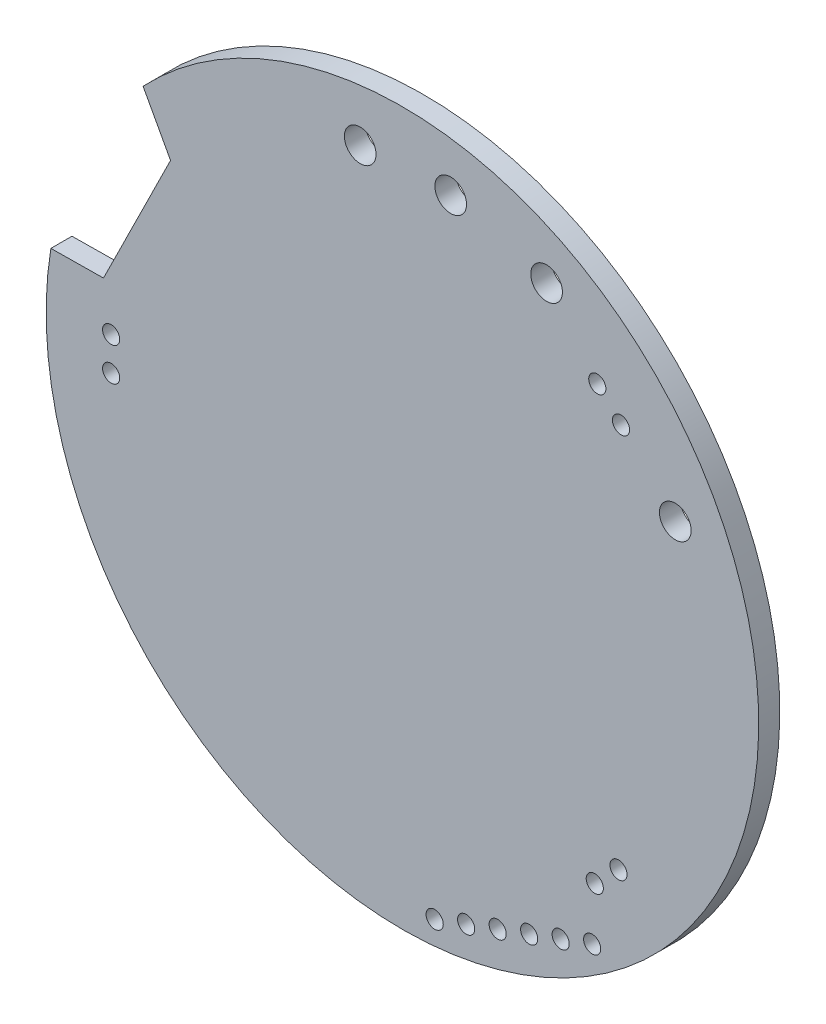
ISO-10303-21;
HEADER;
FILE_DESCRIPTION(('STEP AP214'),'2;1');
FILE_NAME('part.step','',(''),(''),'','','');
FILE_SCHEMA(('AUTOMOTIVE_DESIGN { 1 0 10303 214 1 1 1 1 }'));
ENDSEC;
DATA;
#1=APPLICATION_CONTEXT('core data for automotive mechanical design processes');
#2=APPLICATION_PROTOCOL_DEFINITION('international standard','automotive_design',2000,#1);
#3=PRODUCT_CONTEXT('',#1,'mechanical');
#4=PRODUCT('Part','Part','',(#3));
#5=PRODUCT_RELATED_PRODUCT_CATEGORY('part','',(#4));
#6=PRODUCT_DEFINITION_FORMATION('','',#4);
#7=PRODUCT_DEFINITION_CONTEXT('part definition',#1,'design');
#8=PRODUCT_DEFINITION('design','',#6,#7);
#9=PRODUCT_DEFINITION_SHAPE('','',#8);
#10=(LENGTH_UNIT() NAMED_UNIT(*) SI_UNIT(.MILLI.,.METRE.));
#11=(NAMED_UNIT(*) PLANE_ANGLE_UNIT() SI_UNIT($,.RADIAN.));
#12=(NAMED_UNIT(*) SI_UNIT($,.STERADIAN.) SOLID_ANGLE_UNIT());
#13=UNCERTAINTY_MEASURE_WITH_UNIT(LENGTH_MEASURE(1.E-05),#10,'distance_accuracy_value','');
#14=(GEOMETRIC_REPRESENTATION_CONTEXT(3) GLOBAL_UNCERTAINTY_ASSIGNED_CONTEXT((#13)) GLOBAL_UNIT_ASSIGNED_CONTEXT((#10,
#11,#12)) REPRESENTATION_CONTEXT('',''));
#15=CARTESIAN_POINT('',(0.,0.,0.));
#16=DIRECTION('',(0.,0.,1.));
#17=DIRECTION('',(1.,0.,0.));
#18=AXIS2_PLACEMENT_3D('',#15,#16,#17);
#19=CARTESIAN_POINT('',(77.356002807617,84.533996582031,0.));
#20=DIRECTION('',(0.,0.,-1.));
#21=DIRECTION('',(0.,-1.,0.));
#22=AXIS2_PLACEMENT_3D('',#19,#20,#21);
#23=PLANE('',#22);
#24=CARTESIAN_POINT('',(98.9582476,89.54208914,0.));
#25=DIRECTION('',(0.,0.,1.));
#26=DIRECTION('',(1.,0.,0.));
#27=AXIS2_PLACEMENT_3D('',#24,#25,#26);
#28=CIRCLE('',#27,0.32500062);
#29=CARTESIAN_POINT('',(99.28324822,89.54208914,0.));
#30=VERTEX_POINT('',#29);
#31=EDGE_CURVE('E27',#30,#30,#28,.T.);
#32=ORIENTED_EDGE('',*,*,#31,.F.);
#33=EDGE_LOOP('',(#32));
#34=FACE_BOUND('',#33,.T.);
#35=CARTESIAN_POINT('',(101.0158,87.4014,0.));
#36=DIRECTION('',(0.,0.,1.));
#37=DIRECTION('',(1.,0.,0.));
#38=AXIS2_PLACEMENT_3D('',#35,#36,#37);
#39=CIRCLE('',#38,0.5999988);
#40=CARTESIAN_POINT('',(101.6157988,87.4014,0.));
#41=VERTEX_POINT('',#40);
#42=EDGE_CURVE('E364',#41,#41,#39,.T.);
#43=ORIENTED_EDGE('',*,*,#42,.F.);
#44=EDGE_LOOP('',(#43));
#45=FACE_BOUND('',#44,.T.);
#46=CARTESIAN_POINT('',(96.139,92.7862,0.));
#47=DIRECTION('',(0.,0.,1.));
#48=DIRECTION('',(1.,0.,0.));
#49=AXIS2_PLACEMENT_3D('',#46,#47,#48);
#50=CIRCLE('',#49,0.5999988);
#51=CARTESIAN_POINT('',(96.7389988,92.7862,0.));
#52=VERTEX_POINT('',#51);
#53=EDGE_CURVE('E315',#52,#52,#50,.T.);
#54=ORIENTED_EDGE('',*,*,#53,.F.);
#55=EDGE_LOOP('',(#54));
#56=FACE_BOUND('',#55,.T.);
#57=CARTESIAN_POINT('',(98.06022298,90.44011376,0.));
#58=DIRECTION('',(0.,0.,1.));
#59=DIRECTION('',(1.,0.,0.));
#60=AXIS2_PLACEMENT_3D('',#57,#58,#59);
#61=CIRCLE('',#60,0.32500062);
#62=CARTESIAN_POINT('',(98.3852236,90.44011376,0.));
#63=VERTEX_POINT('',#62);
#64=EDGE_CURVE('E261',#63,#63,#61,.T.);
#65=ORIENTED_EDGE('',*,*,#64,.F.);
#66=EDGE_LOOP('',(#65));
#67=FACE_BOUND('',#66,.T.);
#68=CARTESIAN_POINT('',(98.8633786,74.89722384,0.));
#69=DIRECTION('',(0.,0.,1.));
#70=DIRECTION('',(1.,0.,0.));
#71=AXIS2_PLACEMENT_3D('',#68,#69,#70);
#72=CIRCLE('',#71,0.32500062);
#73=CARTESIAN_POINT('',(99.18837922,74.89722384,0.));
#74=VERTEX_POINT('',#73);
#75=EDGE_CURVE('E209',#74,#74,#72,.T.);
#76=ORIENTED_EDGE('',*,*,#75,.F.);
#77=EDGE_LOOP('',(#76));
#78=FACE_BOUND('',#77,.T.);
#79=CARTESIAN_POINT('',(97.96535398,73.99919922,0.));
#80=DIRECTION('',(0.,0.,1.));
#81=DIRECTION('',(1.,0.,0.));
#82=AXIS2_PLACEMENT_3D('',#79,#80,#81);
#83=CIRCLE('',#82,0.32500062);
#84=CARTESIAN_POINT('',(98.2903546,73.99919922,0.));
#85=VERTEX_POINT('',#84);
#86=EDGE_CURVE('E239',#85,#85,#83,.T.);
#87=ORIENTED_EDGE('',*,*,#86,.F.);
#88=EDGE_LOOP('',(#87));
#89=FACE_BOUND('',#88,.T.);
#90=CARTESIAN_POINT('',(97.8658063,71.96076794,0.));
#91=DIRECTION('',(0.,0.,1.));
#92=DIRECTION('',(1.,0.,0.));
#93=AXIS2_PLACEMENT_3D('',#90,#91,#92);
#94=CIRCLE('',#93,0.32500062);
#95=CARTESIAN_POINT('',(98.19080692,71.96076794,0.));
#96=VERTEX_POINT('',#95);
#97=EDGE_CURVE('E188',#96,#96,#94,.T.);
#98=ORIENTED_EDGE('',*,*,#97,.F.);
#99=EDGE_LOOP('',(#98));
#100=FACE_BOUND('',#99,.T.);
#101=CARTESIAN_POINT('',(96.6724,71.5264,0.));
#102=DIRECTION('',(0.,0.,1.));
#103=DIRECTION('',(1.,0.,0.));
#104=AXIS2_PLACEMENT_3D('',#101,#102,#103);
#105=CIRCLE('',#104,0.32500062);
#106=CARTESIAN_POINT('',(96.99740062,71.5264,0.));
#107=VERTEX_POINT('',#106);
#108=EDGE_CURVE('E195',#107,#107,#105,.T.);
#109=ORIENTED_EDGE('',*,*,#108,.F.);
#110=EDGE_LOOP('',(#109));
#111=FACE_BOUND('',#110,.T.);
#112=CARTESIAN_POINT('',(92.5068,93.853,0.));
#113=DIRECTION('',(0.,0.,1.));
#114=DIRECTION('',(1.,0.,0.));
#115=AXIS2_PLACEMENT_3D('',#112,#113,#114);
#116=CIRCLE('',#115,0.5999988);
#117=CARTESIAN_POINT('',(93.1067988,93.853,0.));
#118=VERTEX_POINT('',#117);
#119=EDGE_CURVE('E250',#118,#118,#116,.T.);
#120=ORIENTED_EDGE('',*,*,#119,.F.);
#121=EDGE_LOOP('',(#120));
#122=FACE_BOUND('',#121,.T.);
#123=CARTESIAN_POINT('',(89.0778,93.7768,0.));
#124=DIRECTION('',(0.,0.,1.));
#125=DIRECTION('',(1.,0.,0.));
#126=AXIS2_PLACEMENT_3D('',#123,#124,#125);
#127=CIRCLE('',#126,0.5999988);
#128=CARTESIAN_POINT('',(89.6777988,93.7768,0.));
#129=VERTEX_POINT('',#128);
#130=EDGE_CURVE('E217',#129,#129,#127,.T.);
#131=ORIENTED_EDGE('',*,*,#130,.F.);
#132=EDGE_LOOP('',(#131));
#133=FACE_BOUND('',#132,.T.);
#134=CARTESIAN_POINT('',(79.6403538,82.8491993,0.));
#135=DIRECTION('',(0.,0.,1.));
#136=DIRECTION('',(1.,0.,0.));
#137=AXIS2_PLACEMENT_3D('',#134,#135,#136);
#138=CIRCLE('',#137,0.32500062);
#139=CARTESIAN_POINT('',(79.96535442,82.8491993,0.));
#140=VERTEX_POINT('',#139);
#141=EDGE_CURVE('E215',#140,#140,#138,.T.);
#142=ORIENTED_EDGE('',*,*,#141,.F.);
#143=EDGE_LOOP('',(#142));
#144=FACE_BOUND('',#143,.T.);
#145=CARTESIAN_POINT('',(79.6403538,81.5791993,0.));
#146=DIRECTION('',(0.,0.,1.));
#147=DIRECTION('',(1.,0.,0.));
#148=AXIS2_PLACEMENT_3D('',#145,#146,#147);
#149=CIRCLE('',#148,0.32500062);
#150=CARTESIAN_POINT('',(79.96535442,81.5791993,0.));
#151=VERTEX_POINT('',#150);
#152=EDGE_CURVE('E249',#151,#151,#149,.T.);
#153=ORIENTED_EDGE('',*,*,#152,.F.);
#154=EDGE_LOOP('',(#153));
#155=FACE_BOUND('',#154,.T.);
#156=CARTESIAN_POINT('',(95.47898862,71.09202952,0.));
#157=DIRECTION('',(0.,0.,1.));
#158=DIRECTION('',(1.,0.,0.));
#159=AXIS2_PLACEMENT_3D('',#156,#157,#158);
#160=CIRCLE('',#159,0.32500062);
#161=CARTESIAN_POINT('',(95.80398924,71.09202952,0.));
#162=VERTEX_POINT('',#161);
#163=EDGE_CURVE('E275',#162,#162,#160,.T.);
#164=ORIENTED_EDGE('',*,*,#163,.F.);
#165=EDGE_LOOP('',(#164));
#166=FACE_BOUND('',#165,.T.);
#167=CARTESIAN_POINT('',(94.28557978,70.6576692,0.));
#168=DIRECTION('',(0.,0.,1.));
#169=DIRECTION('',(1.,0.,0.));
#170=AXIS2_PLACEMENT_3D('',#167,#168,#169);
#171=CIRCLE('',#170,0.32500062);
#172=CARTESIAN_POINT('',(94.6105804,70.6576692,0.));
#173=VERTEX_POINT('',#172);
#174=EDGE_CURVE('E183',#173,#173,#171,.T.);
#175=ORIENTED_EDGE('',*,*,#174,.F.);
#176=EDGE_LOOP('',(#175));
#177=FACE_BOUND('',#176,.T.);
#178=CARTESIAN_POINT('',(93.0921557,70.22329872,0.));
#179=DIRECTION('',(0.,0.,1.));
#180=DIRECTION('',(1.,0.,0.));
#181=AXIS2_PLACEMENT_3D('',#178,#179,#180);
#182=CIRCLE('',#181,0.32500062);
#183=CARTESIAN_POINT('',(93.41715632,70.22329872,0.));
#184=VERTEX_POINT('',#183);
#185=EDGE_CURVE('E236',#184,#184,#182,.T.);
#186=ORIENTED_EDGE('',*,*,#185,.F.);
#187=EDGE_LOOP('',(#186));
#188=FACE_BOUND('',#187,.T.);
#189=CARTESIAN_POINT('',(91.89875448,69.78893586,0.));
#190=DIRECTION('',(0.,0.,1.));
#191=DIRECTION('',(1.,0.,0.));
#192=AXIS2_PLACEMENT_3D('',#189,#190,#191);
#193=CIRCLE('',#192,0.32500062);
#194=CARTESIAN_POINT('',(92.2237551,69.78893586,0.));
#195=VERTEX_POINT('',#194);
#196=EDGE_CURVE('E157',#195,#195,#193,.T.);
#197=ORIENTED_EDGE('',*,*,#196,.F.);
#198=EDGE_LOOP('',(#197));
#199=FACE_BOUND('',#198,.T.);
#200=CARTESIAN_POINT('',(90.677297083043,82.34505011491,0.));
#201=DIRECTION('',(0.,0.,1.));
#202=DIRECTION('',(-0.986766957566009,0.162144908819001,0.));
#203=AXIS2_PLACEMENT_3D('',#200,#201,#202);
#204=CIRCLE('',#203,13.499939548324);
#205=CARTESIAN_POINT('',(77.356002807617,84.533996582031,0.));
#206=VERTEX_POINT('',#205);
#207=CARTESIAN_POINT('',(80.849998474121,91.600997924805,0.));
#208=VERTEX_POINT('',#207);
#209=EDGE_CURVE('E333',#206,#208,#204,.T.);
#210=ORIENTED_EDGE('',*,*,#209,.T.);
#211=DIRECTION('',(0.477436318378299,-0.878666354137551,0.));
#212=VECTOR('',#211,1.);
#213=CARTESIAN_POINT('',(80.849998474121,91.600997924805,0.));
#214=LINE('',#213,#212);
#215=CARTESIAN_POINT('',(81.889999389648,89.686996459961,0.));
#216=VERTEX_POINT('',#215);
#217=EDGE_CURVE('E176',#208,#216,#214,.T.);
#218=ORIENTED_EDGE('',*,*,#217,.T.);
#219=DIRECTION('',(-0.443716673249112,-0.896167123856226,0.));
#220=VECTOR('',#219,1.);
#221=CARTESIAN_POINT('',(81.889999389648,89.686996459961,0.));
#222=LINE('',#221,#220);
#223=CARTESIAN_POINT('',(79.349998474121,84.556999206543,0.));
#224=VERTEX_POINT('',#223);
#225=EDGE_CURVE('E20',#216,#224,#222,.T.);
#226=ORIENTED_EDGE('',*,*,#225,.T.);
#227=DIRECTION('',(-0.999933467625904,-0.0115351775727889,0.));
#228=VECTOR('',#227,1.);
#229=CARTESIAN_POINT('',(79.349998474121,84.556999206543,0.));
#230=LINE('',#229,#228);
#231=EDGE_CURVE('E172',#224,#206,#230,.T.);
#232=ORIENTED_EDGE('',*,*,#231,.T.);
#233=EDGE_LOOP('',(#210,#218,#226,#232));
#234=FACE_BOUND('',#233,.T.);
#235=ADVANCED_FACE('F16',(#34,#45,#56,#67,#78,#89,#100,#111,#122,#133,#144,#155,#166,#177,#188,
#199,#234),#23,.F.);
#236=CARTESIAN_POINT('',(77.356002807617,84.533996582031,-0.7984236));
#237=DIRECTION('',(0.,0.,-1.));
#238=DIRECTION('',(0.,-1.,0.));
#239=AXIS2_PLACEMENT_3D('',#236,#237,#238);
#240=PLANE('',#239);
#241=CARTESIAN_POINT('',(98.9582476,89.54208914,-0.7984236));
#242=DIRECTION('',(0.,0.,1.));
#243=DIRECTION('',(1.,0.,0.));
#244=AXIS2_PLACEMENT_3D('',#241,#242,#243);
#245=CIRCLE('',#244,0.32500062);
#246=CARTESIAN_POINT('',(99.28324822,89.54208914,-0.7984236));
#247=VERTEX_POINT('',#246);
#248=EDGE_CURVE('E11',#247,#247,#245,.T.);
#249=ORIENTED_EDGE('',*,*,#248,.T.);
#250=EDGE_LOOP('',(#249));
#251=FACE_BOUND('',#250,.T.);
#252=CARTESIAN_POINT('',(101.0158,87.4014,-0.7984236));
#253=DIRECTION('',(0.,0.,1.));
#254=DIRECTION('',(1.,0.,0.));
#255=AXIS2_PLACEMENT_3D('',#252,#253,#254);
#256=CIRCLE('',#255,0.5999988);
#257=CARTESIAN_POINT('',(101.6157988,87.4014,-0.7984236));
#258=VERTEX_POINT('',#257);
#259=EDGE_CURVE('E282',#258,#258,#256,.T.);
#260=ORIENTED_EDGE('',*,*,#259,.T.);
#261=EDGE_LOOP('',(#260));
#262=FACE_BOUND('',#261,.T.);
#263=CARTESIAN_POINT('',(96.139,92.7862,-0.7984236));
#264=DIRECTION('',(0.,0.,1.));
#265=DIRECTION('',(1.,0.,0.));
#266=AXIS2_PLACEMENT_3D('',#263,#264,#265);
#267=CIRCLE('',#266,0.5999988);
#268=CARTESIAN_POINT('',(96.7389988,92.7862,-0.7984236));
#269=VERTEX_POINT('',#268);
#270=EDGE_CURVE('E326',#269,#269,#267,.T.);
#271=ORIENTED_EDGE('',*,*,#270,.T.);
#272=EDGE_LOOP('',(#271));
#273=FACE_BOUND('',#272,.T.);
#274=CARTESIAN_POINT('',(98.06022298,90.44011376,-0.7984236));
#275=DIRECTION('',(0.,0.,1.));
#276=DIRECTION('',(1.,0.,0.));
#277=AXIS2_PLACEMENT_3D('',#274,#275,#276);
#278=CIRCLE('',#277,0.32500062);
#279=CARTESIAN_POINT('',(98.3852236,90.44011376,-0.7984236));
#280=VERTEX_POINT('',#279);
#281=EDGE_CURVE('E276',#280,#280,#278,.T.);
#282=ORIENTED_EDGE('',*,*,#281,.T.);
#283=EDGE_LOOP('',(#282));
#284=FACE_BOUND('',#283,.T.);
#285=CARTESIAN_POINT('',(98.8633786,74.89722384,-0.7984236));
#286=DIRECTION('',(0.,0.,1.));
#287=DIRECTION('',(1.,0.,0.));
#288=AXIS2_PLACEMENT_3D('',#285,#286,#287);
#289=CIRCLE('',#288,0.32500062);
#290=CARTESIAN_POINT('',(99.18837922,74.89722384,-0.7984236));
#291=VERTEX_POINT('',#290);
#292=EDGE_CURVE('E227',#291,#291,#289,.T.);
#293=ORIENTED_EDGE('',*,*,#292,.T.);
#294=EDGE_LOOP('',(#293));
#295=FACE_BOUND('',#294,.T.);
#296=CARTESIAN_POINT('',(97.96535398,73.99919922,-0.7984236));
#297=DIRECTION('',(0.,0.,1.));
#298=DIRECTION('',(1.,0.,0.));
#299=AXIS2_PLACEMENT_3D('',#296,#297,#298);
#300=CIRCLE('',#299,0.32500062);
#301=CARTESIAN_POINT('',(98.2903546,73.99919922,-0.7984236));
#302=VERTEX_POINT('',#301);
#303=EDGE_CURVE('E210',#302,#302,#300,.T.);
#304=ORIENTED_EDGE('',*,*,#303,.T.);
#305=EDGE_LOOP('',(#304));
#306=FACE_BOUND('',#305,.T.);
#307=CARTESIAN_POINT('',(97.8658063,71.96076794,-0.7984236));
#308=DIRECTION('',(0.,0.,1.));
#309=DIRECTION('',(1.,0.,0.));
#310=AXIS2_PLACEMENT_3D('',#307,#308,#309);
#311=CIRCLE('',#310,0.32500062);
#312=CARTESIAN_POINT('',(98.19080692,71.96076794,-0.7984236));
#313=VERTEX_POINT('',#312);
#314=EDGE_CURVE('E343',#313,#313,#311,.T.);
#315=ORIENTED_EDGE('',*,*,#314,.T.);
#316=EDGE_LOOP('',(#315));
#317=FACE_BOUND('',#316,.T.);
#318=CARTESIAN_POINT('',(96.6724,71.5264,-0.7984236));
#319=DIRECTION('',(0.,0.,1.));
#320=DIRECTION('',(1.,0.,0.));
#321=AXIS2_PLACEMENT_3D('',#318,#319,#320);
#322=CIRCLE('',#321,0.32500062);
#323=CARTESIAN_POINT('',(96.99740062,71.5264,-0.7984236));
#324=VERTEX_POINT('',#323);
#325=EDGE_CURVE('E189',#324,#324,#322,.T.);
#326=ORIENTED_EDGE('',*,*,#325,.T.);
#327=EDGE_LOOP('',(#326));
#328=FACE_BOUND('',#327,.T.);
#329=CARTESIAN_POINT('',(92.5068,93.853,-0.7984236));
#330=DIRECTION('',(0.,0.,1.));
#331=DIRECTION('',(1.,0.,0.));
#332=AXIS2_PLACEMENT_3D('',#329,#330,#331);
#333=CIRCLE('',#332,0.5999988);
#334=CARTESIAN_POINT('',(93.1067988,93.853,-0.7984236));
#335=VERTEX_POINT('',#334);
#336=EDGE_CURVE('E253',#335,#335,#333,.T.);
#337=ORIENTED_EDGE('',*,*,#336,.T.);
#338=EDGE_LOOP('',(#337));
#339=FACE_BOUND('',#338,.T.);
#340=CARTESIAN_POINT('',(89.0778,93.7768,-0.7984236));
#341=DIRECTION('',(0.,0.,1.));
#342=DIRECTION('',(1.,0.,0.));
#343=AXIS2_PLACEMENT_3D('',#340,#341,#342);
#344=CIRCLE('',#343,0.5999988);
#345=CARTESIAN_POINT('',(89.6777988,93.7768,-0.7984236));
#346=VERTEX_POINT('',#345);
#347=EDGE_CURVE('E220',#346,#346,#344,.T.);
#348=ORIENTED_EDGE('',*,*,#347,.T.);
#349=EDGE_LOOP('',(#348));
#350=FACE_BOUND('',#349,.T.);
#351=CARTESIAN_POINT('',(79.6403538,82.8491993,-0.7984236));
#352=DIRECTION('',(0.,0.,1.));
#353=DIRECTION('',(1.,0.,0.));
#354=AXIS2_PLACEMENT_3D('',#351,#352,#353);
#355=CIRCLE('',#354,0.32500062);
#356=CARTESIAN_POINT('',(79.96535442,82.8491993,-0.7984236));
#357=VERTEX_POINT('',#356);
#358=EDGE_CURVE('E243',#357,#357,#355,.T.);
#359=ORIENTED_EDGE('',*,*,#358,.T.);
#360=EDGE_LOOP('',(#359));
#361=FACE_BOUND('',#360,.T.);
#362=CARTESIAN_POINT('',(79.6403538,81.5791993,-0.7984236));
#363=DIRECTION('',(0.,0.,1.));
#364=DIRECTION('',(1.,0.,0.));
#365=AXIS2_PLACEMENT_3D('',#362,#363,#364);
#366=CIRCLE('',#365,0.32500062);
#367=CARTESIAN_POINT('',(79.96535442,81.5791993,-0.7984236));
#368=VERTEX_POINT('',#367);
#369=EDGE_CURVE('E216',#368,#368,#366,.T.);
#370=ORIENTED_EDGE('',*,*,#369,.T.);
#371=EDGE_LOOP('',(#370));
#372=FACE_BOUND('',#371,.T.);
#373=CARTESIAN_POINT('',(95.47898862,71.09202952,-0.7984236));
#374=DIRECTION('',(0.,0.,1.));
#375=DIRECTION('',(1.,0.,0.));
#376=AXIS2_PLACEMENT_3D('',#373,#374,#375);
#377=CIRCLE('',#376,0.32500062);
#378=CARTESIAN_POINT('',(95.80398924,71.09202952,-0.7984236));
#379=VERTEX_POINT('',#378);
#380=EDGE_CURVE('E271',#379,#379,#377,.T.);
#381=ORIENTED_EDGE('',*,*,#380,.T.);
#382=EDGE_LOOP('',(#381));
#383=FACE_BOUND('',#382,.T.);
#384=CARTESIAN_POINT('',(94.28557978,70.6576692,-0.7984236));
#385=DIRECTION('',(0.,0.,1.));
#386=DIRECTION('',(1.,0.,0.));
#387=AXIS2_PLACEMENT_3D('',#384,#385,#386);
#388=CIRCLE('',#387,0.32500062);
#389=CARTESIAN_POINT('',(94.6105804,70.6576692,-0.7984236));
#390=VERTEX_POINT('',#389);
#391=EDGE_CURVE('E178',#390,#390,#388,.T.);
#392=ORIENTED_EDGE('',*,*,#391,.T.);
#393=EDGE_LOOP('',(#392));
#394=FACE_BOUND('',#393,.T.);
#395=CARTESIAN_POINT('',(93.0921557,70.22329872,-0.7984236));
#396=DIRECTION('',(0.,0.,1.));
#397=DIRECTION('',(1.,0.,0.));
#398=AXIS2_PLACEMENT_3D('',#395,#396,#397);
#399=CIRCLE('',#398,0.32500062);
#400=CARTESIAN_POINT('',(93.41715632,70.22329872,-0.7984236));
#401=VERTEX_POINT('',#400);
#402=EDGE_CURVE('E232',#401,#401,#399,.T.);
#403=ORIENTED_EDGE('',*,*,#402,.T.);
#404=EDGE_LOOP('',(#403));
#405=FACE_BOUND('',#404,.T.);
#406=CARTESIAN_POINT('',(91.89875448,69.78893586,-0.7984236));
#407=DIRECTION('',(0.,0.,1.));
#408=DIRECTION('',(1.,0.,0.));
#409=AXIS2_PLACEMENT_3D('',#406,#407,#408);
#410=CIRCLE('',#409,0.32500062);
#411=CARTESIAN_POINT('',(92.2237551,69.78893586,-0.7984236));
#412=VERTEX_POINT('',#411);
#413=EDGE_CURVE('E163',#412,#412,#410,.T.);
#414=ORIENTED_EDGE('',*,*,#413,.T.);
#415=EDGE_LOOP('',(#414));
#416=FACE_BOUND('',#415,.T.);
#417=DIRECTION('',(-0.999933467625904,-0.0115351775727889,0.));
#418=VECTOR('',#417,1.);
#419=CARTESIAN_POINT('',(79.349998474121,84.556999206543,-0.7984236));
#420=LINE('',#419,#418);
#421=CARTESIAN_POINT('',(79.349998474121,84.556999206543,-0.7984236));
#422=VERTEX_POINT('',#421);
#423=CARTESIAN_POINT('',(77.356002807617,84.533996582031,-0.7984236));
#424=VERTEX_POINT('',#423);
#425=EDGE_CURVE('E268',#422,#424,#420,.T.);
#426=ORIENTED_EDGE('',*,*,#425,.F.);
#427=DIRECTION('',(-0.443716673249112,-0.896167123856226,0.));
#428=VECTOR('',#427,1.);
#429=CARTESIAN_POINT('',(81.889999389648,89.686996459961,-0.7984236));
#430=LINE('',#429,#428);
#431=CARTESIAN_POINT('',(81.889999389648,89.686996459961,-0.7984236));
#432=VERTEX_POINT('',#431);
#433=EDGE_CURVE('E194',#432,#422,#430,.T.);
#434=ORIENTED_EDGE('',*,*,#433,.F.);
#435=DIRECTION('',(0.477436318378299,-0.878666354137551,0.));
#436=VECTOR('',#435,1.);
#437=CARTESIAN_POINT('',(80.849998474121,91.600997924805,-0.7984236));
#438=LINE('',#437,#436);
#439=CARTESIAN_POINT('',(80.849998474121,91.600997924805,-0.7984236));
#440=VERTEX_POINT('',#439);
#441=EDGE_CURVE('E204',#440,#432,#438,.T.);
#442=ORIENTED_EDGE('',*,*,#441,.F.);
#443=CARTESIAN_POINT('',(90.677297083043,82.34505011491,-0.7984236));
#444=DIRECTION('',(0.,0.,1.));
#445=DIRECTION('',(-0.986766957566009,0.162144908819001,0.));
#446=AXIS2_PLACEMENT_3D('',#443,#444,#445);
#447=CIRCLE('',#446,13.499939548324);
#448=EDGE_CURVE('E222',#424,#440,#447,.T.);
#449=ORIENTED_EDGE('',*,*,#448,.F.);
#450=EDGE_LOOP('',(#426,#434,#442,#449));
#451=FACE_BOUND('',#450,.T.);
#452=ADVANCED_FACE('F399',(#251,#262,#273,#284,#295,#306,#317,#328,#339,#350,#361,#372,#383,
#394,#405,#416,#451),#240,.T.);
#453=CARTESIAN_POINT('',(98.9582476,89.54208914,-0.7984236));
#454=DIRECTION('',(0.,0.,-1.));
#455=DIRECTION('',(1.,0.,0.));
#456=AXIS2_PLACEMENT_3D('',#453,#454,#455);
#457=CYLINDRICAL_SURFACE('',#456,0.32500062);
#458=DIRECTION('',(0.,0.,1.));
#459=VECTOR('',#458,1.);
#460=CARTESIAN_POINT('',(99.28324822,89.54208914,-0.7984236));
#461=LINE('',#460,#459);
#462=EDGE_CURVE('E280',#247,#30,#461,.T.);
#463=ORIENTED_EDGE('',*,*,#462,.T.);
#464=ORIENTED_EDGE('',*,*,#31,.T.);
#465=ORIENTED_EDGE('',*,*,#462,.F.);
#466=ORIENTED_EDGE('',*,*,#248,.F.);
#467=EDGE_LOOP('',(#463,#464,#465,#466));
#468=FACE_BOUND('',#467,.T.);
#469=ADVANCED_FACE('F643',(#468),#457,.F.);
#470=CARTESIAN_POINT('',(101.0158,87.4014,-0.7984236));
#471=DIRECTION('',(0.,0.,-1.));
#472=DIRECTION('',(1.,0.,0.));
#473=AXIS2_PLACEMENT_3D('',#470,#471,#472);
#474=CYLINDRICAL_SURFACE('',#473,0.5999988);
#475=DIRECTION('',(0.,0.,1.));
#476=VECTOR('',#475,1.);
#477=CARTESIAN_POINT('',(101.6157988,87.4014,-0.7984236));
#478=LINE('',#477,#476);
#479=EDGE_CURVE('E329',#258,#41,#478,.T.);
#480=ORIENTED_EDGE('',*,*,#479,.T.);
#481=ORIENTED_EDGE('',*,*,#42,.T.);
#482=ORIENTED_EDGE('',*,*,#479,.F.);
#483=ORIENTED_EDGE('',*,*,#259,.F.);
#484=EDGE_LOOP('',(#480,#481,#482,#483));
#485=FACE_BOUND('',#484,.T.);
#486=ADVANCED_FACE('F676',(#485),#474,.F.);
#487=CARTESIAN_POINT('',(96.139,92.7862,-0.7984236));
#488=DIRECTION('',(0.,0.,-1.));
#489=DIRECTION('',(1.,0.,0.));
#490=AXIS2_PLACEMENT_3D('',#487,#488,#489);
#491=CYLINDRICAL_SURFACE('',#490,0.5999988);
#492=DIRECTION('',(0.,0.,1.));
#493=VECTOR('',#492,1.);
#494=CARTESIAN_POINT('',(96.7389988,92.7862,-0.7984236));
#495=LINE('',#494,#493);
#496=EDGE_CURVE('E279',#269,#52,#495,.T.);
#497=ORIENTED_EDGE('',*,*,#496,.T.);
#498=ORIENTED_EDGE('',*,*,#53,.T.);
#499=ORIENTED_EDGE('',*,*,#496,.F.);
#500=ORIENTED_EDGE('',*,*,#270,.F.);
#501=EDGE_LOOP('',(#497,#498,#499,#500));
#502=FACE_BOUND('',#501,.T.);
#503=ADVANCED_FACE('F451',(#502),#491,.F.);
#504=CARTESIAN_POINT('',(98.06022298,90.44011376,-0.7984236));
#505=DIRECTION('',(0.,0.,-1.));
#506=DIRECTION('',(1.,0.,0.));
#507=AXIS2_PLACEMENT_3D('',#504,#505,#506);
#508=CYLINDRICAL_SURFACE('',#507,0.32500062);
#509=DIRECTION('',(0.,0.,1.));
#510=VECTOR('',#509,1.);
#511=CARTESIAN_POINT('',(98.3852236,90.44011376,-0.7984236));
#512=LINE('',#511,#510);
#513=EDGE_CURVE('E231',#280,#63,#512,.T.);
#514=ORIENTED_EDGE('',*,*,#513,.T.);
#515=ORIENTED_EDGE('',*,*,#64,.T.);
#516=ORIENTED_EDGE('',*,*,#513,.F.);
#517=ORIENTED_EDGE('',*,*,#281,.F.);
#518=EDGE_LOOP('',(#514,#515,#516,#517));
#519=FACE_BOUND('',#518,.T.);
#520=ADVANCED_FACE('F627',(#519),#508,.F.);
#521=CARTESIAN_POINT('',(98.8633786,74.89722384,-0.7984236));
#522=DIRECTION('',(0.,0.,-1.));
#523=DIRECTION('',(1.,0.,0.));
#524=AXIS2_PLACEMENT_3D('',#521,#522,#523);
#525=CYLINDRICAL_SURFACE('',#524,0.32500062);
#526=DIRECTION('',(0.,0.,1.));
#527=VECTOR('',#526,1.);
#528=CARTESIAN_POINT('',(99.18837922,74.89722384,-0.7984236));
#529=LINE('',#528,#527);
#530=EDGE_CURVE('E205',#291,#74,#529,.T.);
#531=ORIENTED_EDGE('',*,*,#530,.T.);
#532=ORIENTED_EDGE('',*,*,#75,.T.);
#533=ORIENTED_EDGE('',*,*,#530,.F.);
#534=ORIENTED_EDGE('',*,*,#292,.F.);
#535=EDGE_LOOP('',(#531,#532,#533,#534));
#536=FACE_BOUND('',#535,.T.);
#537=ADVANCED_FACE('F632',(#536),#525,.F.);
#538=CARTESIAN_POINT('',(97.96535398,73.99919922,-0.7984236));
#539=DIRECTION('',(0.,0.,-1.));
#540=DIRECTION('',(1.,0.,0.));
#541=AXIS2_PLACEMENT_3D('',#538,#539,#540);
#542=CYLINDRICAL_SURFACE('',#541,0.32500062);
#543=DIRECTION('',(0.,0.,1.));
#544=VECTOR('',#543,1.);
#545=CARTESIAN_POINT('',(98.2903546,73.99919922,-0.7984236));
#546=LINE('',#545,#544);
#547=EDGE_CURVE('E320',#302,#85,#546,.T.);
#548=ORIENTED_EDGE('',*,*,#547,.T.);
#549=ORIENTED_EDGE('',*,*,#86,.T.);
#550=ORIENTED_EDGE('',*,*,#547,.F.);
#551=ORIENTED_EDGE('',*,*,#303,.F.);
#552=EDGE_LOOP('',(#548,#549,#550,#551));
#553=FACE_BOUND('',#552,.T.);
#554=ADVANCED_FACE('F608',(#553),#542,.F.);
#555=CARTESIAN_POINT('',(97.8658063,71.96076794,-0.7984236));
#556=DIRECTION('',(0.,0.,-1.));
#557=DIRECTION('',(1.,0.,0.));
#558=AXIS2_PLACEMENT_3D('',#555,#556,#557);
#559=CYLINDRICAL_SURFACE('',#558,0.32500062);
#560=DIRECTION('',(0.,0.,1.));
#561=VECTOR('',#560,1.);
#562=CARTESIAN_POINT('',(98.19080692,71.96076794,-0.7984236));
#563=LINE('',#562,#561);
#564=EDGE_CURVE('E184',#313,#96,#563,.T.);
#565=ORIENTED_EDGE('',*,*,#564,.T.);
#566=ORIENTED_EDGE('',*,*,#97,.T.);
#567=ORIENTED_EDGE('',*,*,#564,.F.);
#568=ORIENTED_EDGE('',*,*,#314,.F.);
#569=EDGE_LOOP('',(#565,#566,#567,#568));
#570=FACE_BOUND('',#569,.T.);
#571=ADVANCED_FACE('F602',(#570),#559,.F.);
#572=CARTESIAN_POINT('',(96.6724,71.5264,-0.7984236));
#573=DIRECTION('',(0.,0.,-1.));
#574=DIRECTION('',(1.,0.,0.));
#575=AXIS2_PLACEMENT_3D('',#572,#573,#574);
#576=CYLINDRICAL_SURFACE('',#575,0.32500062);
#577=DIRECTION('',(0.,0.,1.));
#578=VECTOR('',#577,1.);
#579=CARTESIAN_POINT('',(96.99740062,71.5264,-0.7984236));
#580=LINE('',#579,#578);
#581=EDGE_CURVE('E198',#324,#107,#580,.T.);
#582=ORIENTED_EDGE('',*,*,#581,.T.);
#583=ORIENTED_EDGE('',*,*,#108,.T.);
#584=ORIENTED_EDGE('',*,*,#581,.F.);
#585=ORIENTED_EDGE('',*,*,#325,.F.);
#586=EDGE_LOOP('',(#582,#583,#584,#585));
#587=FACE_BOUND('',#586,.T.);
#588=ADVANCED_FACE('F607',(#587),#576,.F.);
#589=CARTESIAN_POINT('',(92.5068,93.853,-0.7984236));
#590=DIRECTION('',(0.,0.,-1.));
#591=DIRECTION('',(1.,0.,0.));
#592=AXIS2_PLACEMENT_3D('',#589,#590,#591);
#593=CYLINDRICAL_SURFACE('',#592,0.5999988);
#594=DIRECTION('',(0.,0.,1.));
#595=VECTOR('',#594,1.);
#596=CARTESIAN_POINT('',(93.1067988,93.853,-0.7984236));
#597=LINE('',#596,#595);
#598=EDGE_CURVE('E254',#335,#118,#597,.T.);
#599=ORIENTED_EDGE('',*,*,#598,.T.);
#600=ORIENTED_EDGE('',*,*,#119,.T.);
#601=ORIENTED_EDGE('',*,*,#598,.F.);
#602=ORIENTED_EDGE('',*,*,#336,.F.);
#603=EDGE_LOOP('',(#599,#600,#601,#602));
#604=FACE_BOUND('',#603,.T.);
#605=ADVANCED_FACE('F720',(#604),#593,.F.);
#606=CARTESIAN_POINT('',(89.0778,93.7768,-0.7984236));
#607=DIRECTION('',(0.,0.,-1.));
#608=DIRECTION('',(1.,0.,0.));
#609=AXIS2_PLACEMENT_3D('',#606,#607,#608);
#610=CYLINDRICAL_SURFACE('',#609,0.5999988);
#611=DIRECTION('',(0.,0.,1.));
#612=VECTOR('',#611,1.);
#613=CARTESIAN_POINT('',(89.6777988,93.7768,-0.7984236));
#614=LINE('',#613,#612);
#615=EDGE_CURVE('E221',#346,#129,#614,.T.);
#616=ORIENTED_EDGE('',*,*,#615,.T.);
#617=ORIENTED_EDGE('',*,*,#130,.T.);
#618=ORIENTED_EDGE('',*,*,#615,.F.);
#619=ORIENTED_EDGE('',*,*,#347,.F.);
#620=EDGE_LOOP('',(#616,#617,#618,#619));
#621=FACE_BOUND('',#620,.T.);
#622=ADVANCED_FACE('F304',(#621),#610,.F.);
#623=CARTESIAN_POINT('',(79.6403538,82.8491993,-0.7984236));
#624=DIRECTION('',(0.,0.,-1.));
#625=DIRECTION('',(1.,0.,0.));
#626=AXIS2_PLACEMENT_3D('',#623,#624,#625);
#627=CYLINDRICAL_SURFACE('',#626,0.32500062);
#628=DIRECTION('',(0.,0.,1.));
#629=VECTOR('',#628,1.);
#630=CARTESIAN_POINT('',(79.96535442,82.8491993,-0.7984236));
#631=LINE('',#630,#629);
#632=EDGE_CURVE('E211',#357,#140,#631,.T.);
#633=ORIENTED_EDGE('',*,*,#632,.T.);
#634=ORIENTED_EDGE('',*,*,#141,.T.);
#635=ORIENTED_EDGE('',*,*,#632,.F.);
#636=ORIENTED_EDGE('',*,*,#358,.F.);
#637=EDGE_LOOP('',(#633,#634,#635,#636));
#638=FACE_BOUND('',#637,.T.);
#639=ADVANCED_FACE('F698',(#638),#627,.F.);
#640=CARTESIAN_POINT('',(79.6403538,81.5791993,-0.7984236));
#641=DIRECTION('',(0.,0.,-1.));
#642=DIRECTION('',(1.,0.,0.));
#643=AXIS2_PLACEMENT_3D('',#640,#641,#642);
#644=CYLINDRICAL_SURFACE('',#643,0.32500062);
#645=DIRECTION('',(0.,0.,1.));
#646=VECTOR('',#645,1.);
#647=CARTESIAN_POINT('',(79.96535442,81.5791993,-0.7984236));
#648=LINE('',#647,#646);
#649=EDGE_CURVE('E274',#368,#151,#648,.T.);
#650=ORIENTED_EDGE('',*,*,#649,.T.);
#651=ORIENTED_EDGE('',*,*,#152,.T.);
#652=ORIENTED_EDGE('',*,*,#649,.F.);
#653=ORIENTED_EDGE('',*,*,#369,.F.);
#654=EDGE_LOOP('',(#650,#651,#652,#653));
#655=FACE_BOUND('',#654,.T.);
#656=ADVANCED_FACE('F663',(#655),#644,.F.);
#657=CARTESIAN_POINT('',(95.47898862,71.09202952,-0.7984236));
#658=DIRECTION('',(0.,0.,-1.));
#659=DIRECTION('',(1.,0.,0.));
#660=AXIS2_PLACEMENT_3D('',#657,#658,#659);
#661=CYLINDRICAL_SURFACE('',#660,0.32500062);
#662=DIRECTION('',(0.,0.,1.));
#663=VECTOR('',#662,1.);
#664=CARTESIAN_POINT('',(95.80398924,71.09202952,-0.7984236));
#665=LINE('',#664,#663);
#666=EDGE_CURVE('E182',#379,#162,#665,.T.);
#667=ORIENTED_EDGE('',*,*,#666,.T.);
#668=ORIENTED_EDGE('',*,*,#163,.T.);
#669=ORIENTED_EDGE('',*,*,#666,.F.);
#670=ORIENTED_EDGE('',*,*,#380,.F.);
#671=EDGE_LOOP('',(#667,#668,#669,#670));
#672=FACE_BOUND('',#671,.T.);
#673=ADVANCED_FACE('F657',(#672),#661,.F.);
#674=CARTESIAN_POINT('',(94.28557978,70.6576692,-0.7984236));
#675=DIRECTION('',(0.,0.,-1.));
#676=DIRECTION('',(1.,0.,0.));
#677=AXIS2_PLACEMENT_3D('',#674,#675,#676);
#678=CYLINDRICAL_SURFACE('',#677,0.32500062);
#679=DIRECTION('',(0.,0.,1.));
#680=VECTOR('',#679,1.);
#681=CARTESIAN_POINT('',(94.6105804,70.6576692,-0.7984236));
#682=LINE('',#681,#680);
#683=EDGE_CURVE('E235',#390,#173,#682,.T.);
#684=ORIENTED_EDGE('',*,*,#683,.T.);
#685=ORIENTED_EDGE('',*,*,#174,.T.);
#686=ORIENTED_EDGE('',*,*,#683,.F.);
#687=ORIENTED_EDGE('',*,*,#391,.F.);
#688=EDGE_LOOP('',(#684,#685,#686,#687));
#689=FACE_BOUND('',#688,.T.);
#690=ADVANCED_FACE('F662',(#689),#678,.F.);
#691=CARTESIAN_POINT('',(93.0921557,70.22329872,-0.7984236));
#692=DIRECTION('',(0.,0.,-1.));
#693=DIRECTION('',(1.,0.,0.));
#694=AXIS2_PLACEMENT_3D('',#691,#692,#693);
#695=CYLINDRICAL_SURFACE('',#694,0.32500062);
#696=DIRECTION('',(0.,0.,1.));
#697=VECTOR('',#696,1.);
#698=CARTESIAN_POINT('',(93.41715632,70.22329872,-0.7984236));
#699=LINE('',#698,#697);
#700=EDGE_CURVE('E170',#401,#184,#699,.T.);
#701=ORIENTED_EDGE('',*,*,#700,.T.);
#702=ORIENTED_EDGE('',*,*,#185,.T.);
#703=ORIENTED_EDGE('',*,*,#700,.F.);
#704=ORIENTED_EDGE('',*,*,#402,.F.);
#705=EDGE_LOOP('',(#701,#702,#703,#704));
#706=FACE_BOUND('',#705,.T.);
#707=ADVANCED_FACE('F395',(#706),#695,.F.);
#708=CARTESIAN_POINT('',(91.89875448,69.78893586,-0.7984236));
#709=DIRECTION('',(0.,0.,-1.));
#710=DIRECTION('',(1.,0.,0.));
#711=AXIS2_PLACEMENT_3D('',#708,#709,#710);
#712=CYLINDRICAL_SURFACE('',#711,0.32500062);
#713=DIRECTION('',(0.,0.,1.));
#714=VECTOR('',#713,1.);
#715=CARTESIAN_POINT('',(92.2237551,69.78893586,-0.7984236));
#716=LINE('',#715,#714);
#717=EDGE_CURVE('E160',#412,#195,#716,.T.);
#718=ORIENTED_EDGE('',*,*,#717,.T.);
#719=ORIENTED_EDGE('',*,*,#196,.T.);
#720=ORIENTED_EDGE('',*,*,#717,.F.);
#721=ORIENTED_EDGE('',*,*,#413,.F.);
#722=EDGE_LOOP('',(#718,#719,#720,#721));
#723=FACE_BOUND('',#722,.T.);
#724=ADVANCED_FACE('F158',(#723),#712,.F.);
#725=CARTESIAN_POINT('',(79.349998474121,84.556999206543,-0.7984236));
#726=DIRECTION('',(0.0115351775727889,-0.999933467625904,0.));
#727=DIRECTION('',(0.,0.,-1.));
#728=AXIS2_PLACEMENT_3D('',#725,#726,#727);
#729=PLANE('',#728);
#730=ORIENTED_EDGE('',*,*,#425,.T.);
#731=DIRECTION('',(0.,0.,1.));
#732=VECTOR('',#731,1.);
#733=CARTESIAN_POINT('',(77.356002807617,84.533996582031,-0.7984236));
#734=LINE('',#733,#732);
#735=EDGE_CURVE('E265',#424,#206,#734,.T.);
#736=ORIENTED_EDGE('',*,*,#735,.T.);
#737=ORIENTED_EDGE('',*,*,#231,.F.);
#738=DIRECTION('',(0.,0.,1.));
#739=VECTOR('',#738,1.);
#740=CARTESIAN_POINT('',(79.349998474121,84.556999206543,-0.7984236));
#741=LINE('',#740,#739);
#742=EDGE_CURVE('E190',#422,#224,#741,.T.);
#743=ORIENTED_EDGE('',*,*,#742,.F.);
#744=EDGE_LOOP('',(#730,#736,#737,#743));
#745=FACE_BOUND('',#744,.T.);
#746=ADVANCED_FACE('F620',(#745),#729,.F.);
#747=CARTESIAN_POINT('',(81.889999389648,89.686996459961,-0.7984236));
#748=DIRECTION('',(0.896167123856226,-0.443716673249112,0.));
#749=DIRECTION('',(0.,0.,-1.));
#750=AXIS2_PLACEMENT_3D('',#747,#748,#749);
#751=PLANE('',#750);
#752=ORIENTED_EDGE('',*,*,#433,.T.);
#753=ORIENTED_EDGE('',*,*,#742,.T.);
#754=ORIENTED_EDGE('',*,*,#225,.F.);
#755=DIRECTION('',(0.,0.,1.));
#756=VECTOR('',#755,1.);
#757=CARTESIAN_POINT('',(81.889999389648,89.686996459961,-0.7984236));
#758=LINE('',#757,#756);
#759=EDGE_CURVE('E200',#432,#216,#758,.T.);
#760=ORIENTED_EDGE('',*,*,#759,.F.);
#761=EDGE_LOOP('',(#752,#753,#754,#760));
#762=FACE_BOUND('',#761,.T.);
#763=ADVANCED_FACE('F615',(#762),#751,.F.);
#764=CARTESIAN_POINT('',(80.849998474121,91.600997924805,-0.7984236));
#765=DIRECTION('',(0.878666354137551,0.477436318378299,0.));
#766=DIRECTION('',(0.,0.,-1.));
#767=AXIS2_PLACEMENT_3D('',#764,#765,#766);
#768=PLANE('',#767);
#769=ORIENTED_EDGE('',*,*,#441,.T.);
#770=ORIENTED_EDGE('',*,*,#759,.T.);
#771=ORIENTED_EDGE('',*,*,#217,.F.);
#772=DIRECTION('',(0.,0.,1.));
#773=VECTOR('',#772,1.);
#774=CARTESIAN_POINT('',(80.849998474121,91.600997924805,-0.7984236));
#775=LINE('',#774,#773);
#776=EDGE_CURVE('E226',#440,#208,#775,.T.);
#777=ORIENTED_EDGE('',*,*,#776,.F.);
#778=EDGE_LOOP('',(#769,#770,#771,#777));
#779=FACE_BOUND('',#778,.T.);
#780=ADVANCED_FACE('F18',(#779),#768,.F.);
#781=CARTESIAN_POINT('',(90.677297083043,82.34505011491,-0.7984236));
#782=DIRECTION('',(0.,0.,-1.));
#783=DIRECTION('',(-0.986766957566009,0.162144908819001,0.));
#784=AXIS2_PLACEMENT_3D('',#781,#782,#783);
#785=CYLINDRICAL_SURFACE('',#784,13.499939548324);
#786=ORIENTED_EDGE('',*,*,#448,.T.);
#787=ORIENTED_EDGE('',*,*,#776,.T.);
#788=ORIENTED_EDGE('',*,*,#209,.F.);
#789=ORIENTED_EDGE('',*,*,#735,.F.);
#790=EDGE_LOOP('',(#786,#787,#788,#789));
#791=FACE_BOUND('',#790,.T.);
#792=ADVANCED_FACE('F410',(#791),#785,.T.);
#793=CLOSED_SHELL('',(#235,#452,#469,#486,#503,#520,#537,#554,#571,#588,#605,#622,#639,#656,
#673,#690,#707,#724,#746,#763,#780,#792));
#794=MANIFOLD_SOLID_BREP('B1',#793);
#795=ADVANCED_BREP_SHAPE_REPRESENTATION('',(#18,#794),#14);
#796=SHAPE_DEFINITION_REPRESENTATION(#9,#795);
ENDSEC;
END-ISO-10303-21;
